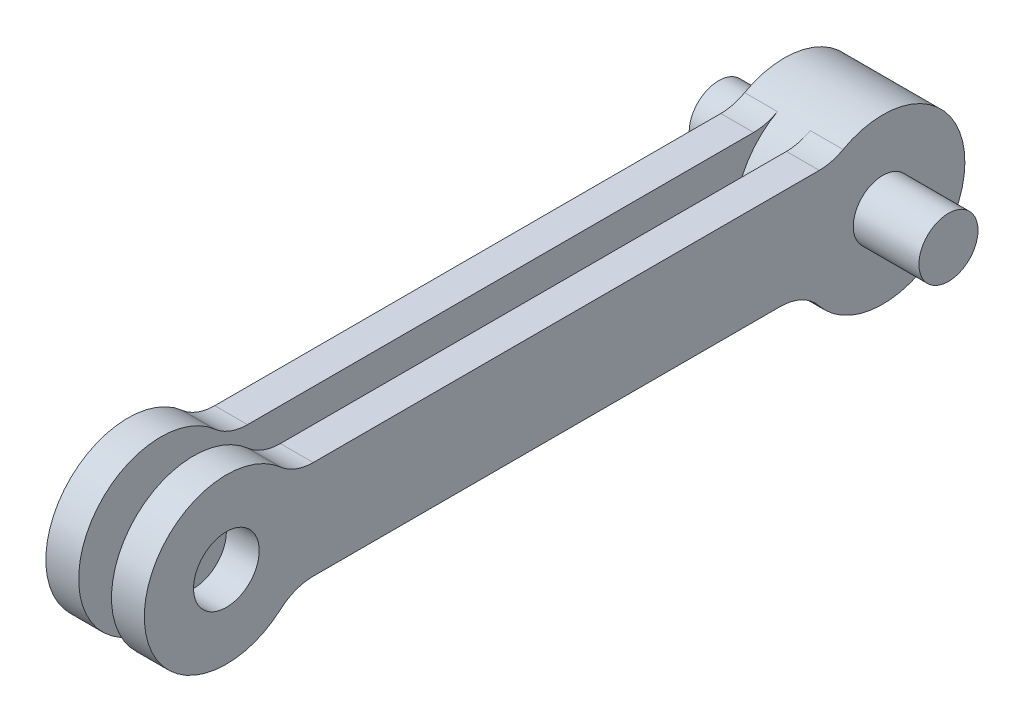
ISO-10303-21;
HEADER;
FILE_DESCRIPTION(('STEP AP214'),'2;1');
FILE_NAME('part.step','',(''),(''),'','','');
FILE_SCHEMA(('AUTOMOTIVE_DESIGN { 1 0 10303 214 1 1 1 1 }'));
ENDSEC;
DATA;
#1=APPLICATION_CONTEXT('core data for automotive mechanical design processes');
#2=APPLICATION_PROTOCOL_DEFINITION('international standard','automotive_design',2000,#1);
#3=PRODUCT_CONTEXT('',#1,'mechanical');
#4=PRODUCT('Part','Part','',(#3));
#5=PRODUCT_RELATED_PRODUCT_CATEGORY('part','',(#4));
#6=PRODUCT_DEFINITION_FORMATION('','',#4);
#7=PRODUCT_DEFINITION_CONTEXT('part definition',#1,'design');
#8=PRODUCT_DEFINITION('design','',#6,#7);
#9=PRODUCT_DEFINITION_SHAPE('','',#8);
#10=(LENGTH_UNIT() NAMED_UNIT(*) SI_UNIT(.MILLI.,.METRE.));
#11=(NAMED_UNIT(*) PLANE_ANGLE_UNIT() SI_UNIT($,.RADIAN.));
#12=(NAMED_UNIT(*) SI_UNIT($,.STERADIAN.) SOLID_ANGLE_UNIT());
#13=UNCERTAINTY_MEASURE_WITH_UNIT(LENGTH_MEASURE(1.E-05),#10,'distance_accuracy_value','');
#14=(GEOMETRIC_REPRESENTATION_CONTEXT(3) GLOBAL_UNCERTAINTY_ASSIGNED_CONTEXT((#13)) GLOBAL_UNIT_ASSIGNED_CONTEXT((#10,
#11,#12)) REPRESENTATION_CONTEXT('',''));
#15=CARTESIAN_POINT('',(0.,0.,0.));
#16=DIRECTION('',(0.,0.,1.));
#17=DIRECTION('',(1.,0.,0.));
#18=AXIS2_PLACEMENT_3D('',#15,#16,#17);
#19=CARTESIAN_POINT('',(0.,0.,0.));
#20=DIRECTION('',(1.,0.,0.));
#21=DIRECTION('',(0.,0.,-1.));
#22=AXIS2_PLACEMENT_3D('',#19,#20,#21);
#23=PLANE('',#22);
#24=CARTESIAN_POINT('',(0.,0.,0.));
#25=DIRECTION('',(1.,0.,0.));
#26=DIRECTION('',(0.,0.,-1.));
#27=AXIS2_PLACEMENT_3D('',#24,#25,#26);
#28=CIRCLE('',#27,2.);
#29=CARTESIAN_POINT('',(0.,0.,-2.));
#30=VERTEX_POINT('',#29);
#31=EDGE_CURVE('E236',#30,#30,#28,.T.);
#32=ORIENTED_EDGE('',*,*,#31,.T.);
#33=EDGE_LOOP('',(#32));
#34=FACE_BOUND('',#33,.T.);
#35=CARTESIAN_POINT('',(0.,5.99999999999999,-36.1270166537926));
#36=DIRECTION('',(1.,0.,0.));
#37=DIRECTION('',(0.,0.,-1.));
#38=AXIS2_PLACEMENT_3D('',#35,#36,#37);
#39=CIRCLE('',#38,3.);
#40=CARTESIAN_POINT('',(0.,2.99999999999999,-36.1270166537926));
#41=VERTEX_POINT('',#40);
#42=CARTESIAN_POINT('',(0.,3.375,-37.5793854086204));
#43=VERTEX_POINT('',#42);
#44=EDGE_CURVE('E86',#41,#43,#39,.T.);
#45=ORIENTED_EDGE('',*,*,#44,.T.);
#46=CARTESIAN_POINT('',(0.,-1.00000000000001,-40.));
#47=DIRECTION('',(1.,0.,0.));
#48=DIRECTION('',(0.,0.,-1.));
#49=AXIS2_PLACEMENT_3D('',#46,#47,#48);
#50=CIRCLE('',#49,5.);
#51=CARTESIAN_POINT('',(0.,-4.12499999999998,-36.096876251001));
#52=VERTEX_POINT('',#51);
#53=EDGE_CURVE('E231',#43,#52,#50,.T.);
#54=ORIENTED_EDGE('',*,*,#53,.T.);
#55=CARTESIAN_POINT('',(0.,-6.00000000000001,-33.7550020016016));
#56=DIRECTION('',(1.,0.,0.));
#57=DIRECTION('',(0.,0.,-1.));
#58=AXIS2_PLACEMENT_3D('',#55,#56,#57);
#59=CIRCLE('',#58,3.);
#60=CARTESIAN_POINT('',(0.,-3.00000000000001,-33.7550020016016));
#61=VERTEX_POINT('',#60);
#62=EDGE_CURVE('E282',#52,#61,#59,.T.);
#63=ORIENTED_EDGE('',*,*,#62,.T.);
#64=DIRECTION('',(0.,0.,-1.));
#65=VECTOR('',#64,1.);
#66=CARTESIAN_POINT('',(0.,-3.00000000000001,0.));
#67=LINE('',#66,#65);
#68=CARTESIAN_POINT('',(0.,-3.00000000000001,-5.29150262212916));
#69=VERTEX_POINT('',#68);
#70=EDGE_CURVE('E251',#69,#61,#67,.T.);
#71=ORIENTED_EDGE('',*,*,#70,.F.);
#72=CARTESIAN_POINT('',(0.,-6.00000000000001,-5.29150262212916));
#73=DIRECTION('',(1.,0.,0.));
#74=DIRECTION('',(0.,0.,-1.));
#75=AXIS2_PLACEMENT_3D('',#72,#73,#74);
#76=CIRCLE('',#75,3.);
#77=CARTESIAN_POINT('',(0.,-3.75,-3.30718913883072));
#78=VERTEX_POINT('',#77);
#79=EDGE_CURVE('E278',#69,#78,#76,.T.);
#80=ORIENTED_EDGE('',*,*,#79,.T.);
#81=CARTESIAN_POINT('',(0.,0.,0.));
#82=DIRECTION('',(1.,0.,0.));
#83=DIRECTION('',(0.,0.,-1.));
#84=AXIS2_PLACEMENT_3D('',#81,#82,#83);
#85=CIRCLE('',#84,4.99999999999999);
#86=CARTESIAN_POINT('',(0.,3.74999999999999,-3.30718913883074));
#87=VERTEX_POINT('',#86);
#88=EDGE_CURVE('E244',#87,#78,#85,.T.);
#89=ORIENTED_EDGE('',*,*,#88,.F.);
#90=CARTESIAN_POINT('',(0.,5.99999999999999,-5.29150262212918));
#91=DIRECTION('',(1.,0.,0.));
#92=DIRECTION('',(0.,0.,-1.));
#93=AXIS2_PLACEMENT_3D('',#90,#91,#92);
#94=CIRCLE('',#93,3.);
#95=CARTESIAN_POINT('',(0.,2.99999999999999,-5.29150262212918));
#96=VERTEX_POINT('',#95);
#97=EDGE_CURVE('E79',#87,#96,#94,.T.);
#98=ORIENTED_EDGE('',*,*,#97,.T.);
#99=DIRECTION('',(0.,0.,-1.));
#100=VECTOR('',#99,1.);
#101=CARTESIAN_POINT('',(0.,2.99999999999999,0.));
#102=LINE('',#101,#100);
#103=EDGE_CURVE('E254',#96,#41,#102,.T.);
#104=ORIENTED_EDGE('',*,*,#103,.T.);
#105=EDGE_LOOP('',(#45,#54,#63,#71,#80,#89,#98,#104));
#106=FACE_BOUND('',#105,.T.);
#107=ADVANCED_FACE('F71',(#34,#106),#23,.F.);
#108=CARTESIAN_POINT('',(2.,0.,0.));
#109=DIRECTION('',(1.,0.,0.));
#110=DIRECTION('',(0.,0.,-1.));
#111=AXIS2_PLACEMENT_3D('',#108,#109,#110);
#112=PLANE('',#111);
#113=CARTESIAN_POINT('',(2.,-0.999999999999973,-39.9999999999999));
#114=DIRECTION('',(1.,0.,0.));
#115=DIRECTION('',(0.,0.,-0.999999999999997));
#116=AXIS2_PLACEMENT_3D('',#113,#114,#115);
#117=CIRCLE('',#116,1.8);
#118=CARTESIAN_POINT('',(2.,-0.999999999999973,-41.7999999999999));
#119=VERTEX_POINT('',#118);
#120=EDGE_CURVE('E533',#119,#119,#117,.T.);
#121=ORIENTED_EDGE('',*,*,#120,.F.);
#122=EDGE_LOOP('',(#121));
#123=FACE_BOUND('',#122,.T.);
#124=CARTESIAN_POINT('',(2.,0.,0.));
#125=DIRECTION('',(1.,0.,0.));
#126=DIRECTION('',(0.,0.,-1.));
#127=AXIS2_PLACEMENT_3D('',#124,#125,#126);
#128=CIRCLE('',#127,2.);
#129=CARTESIAN_POINT('',(2.,0.,-2.));
#130=VERTEX_POINT('',#129);
#131=EDGE_CURVE('E233',#130,#130,#128,.T.);
#132=ORIENTED_EDGE('',*,*,#131,.F.);
#133=EDGE_LOOP('',(#132));
#134=FACE_BOUND('',#133,.T.);
#135=DIRECTION('',(0.,0.,-1.));
#136=VECTOR('',#135,1.);
#137=CARTESIAN_POINT('',(2.,-3.00000000000001,0.));
#138=LINE('',#137,#136);
#139=CARTESIAN_POINT('',(2.,-3.00000000000001,-5.29150262212916));
#140=VERTEX_POINT('',#139);
#141=CARTESIAN_POINT('',(2.,-3.00000000000001,-33.7550020016016));
#142=VERTEX_POINT('',#141);
#143=EDGE_CURVE('E247',#140,#142,#138,.T.);
#144=ORIENTED_EDGE('',*,*,#143,.T.);
#145=CARTESIAN_POINT('',(2.,-6.00000000000001,-33.7550020016016));
#146=DIRECTION('',(1.,0.,0.));
#147=DIRECTION('',(0.,0.,-1.));
#148=AXIS2_PLACEMENT_3D('',#145,#146,#147);
#149=CIRCLE('',#148,3.);
#150=CARTESIAN_POINT('',(2.,-4.125,-36.096876251001));
#151=VERTEX_POINT('',#150);
#152=EDGE_CURVE('E284',#142,#151,#149,.F.);
#153=ORIENTED_EDGE('',*,*,#152,.T.);
#154=CARTESIAN_POINT('',(2.,-1.00000000000001,-40.));
#155=DIRECTION('',(1.,0.,0.));
#156=DIRECTION('',(0.,0.,-1.));
#157=AXIS2_PLACEMENT_3D('',#154,#155,#156);
#158=CIRCLE('',#157,5.);
#159=CARTESIAN_POINT('',(2.,3.375,-37.5793854086204));
#160=VERTEX_POINT('',#159);
#161=EDGE_CURVE('E239',#151,#160,#158,.T.);
#162=ORIENTED_EDGE('',*,*,#161,.T.);
#163=CARTESIAN_POINT('',(2.,5.99999999999999,-36.1270166537926));
#164=DIRECTION('',(1.,0.,0.));
#165=DIRECTION('',(0.,0.,-1.));
#166=AXIS2_PLACEMENT_3D('',#163,#164,#165);
#167=CIRCLE('',#166,3.);
#168=CARTESIAN_POINT('',(2.,2.99999999999999,-36.1270166537926));
#169=VERTEX_POINT('',#168);
#170=EDGE_CURVE('E287',#160,#169,#167,.F.);
#171=ORIENTED_EDGE('',*,*,#170,.T.);
#172=DIRECTION('',(0.,0.,-1.));
#173=VECTOR('',#172,1.);
#174=CARTESIAN_POINT('',(2.,2.99999999999999,0.));
#175=LINE('',#174,#173);
#176=CARTESIAN_POINT('',(2.,2.99999999999999,-5.29150262212918));
#177=VERTEX_POINT('',#176);
#178=EDGE_CURVE('E248',#177,#169,#175,.T.);
#179=ORIENTED_EDGE('',*,*,#178,.F.);
#180=CARTESIAN_POINT('',(2.,5.99999999999999,-5.29150262212918));
#181=DIRECTION('',(1.,0.,0.));
#182=DIRECTION('',(0.,0.,-1.));
#183=AXIS2_PLACEMENT_3D('',#180,#181,#182);
#184=CIRCLE('',#183,3.);
#185=CARTESIAN_POINT('',(2.,3.74999999999999,-3.30718913883074));
#186=VERTEX_POINT('',#185);
#187=EDGE_CURVE('E12',#177,#186,#184,.F.);
#188=ORIENTED_EDGE('',*,*,#187,.T.);
#189=CARTESIAN_POINT('',(2.,0.,0.));
#190=DIRECTION('',(1.,0.,0.));
#191=DIRECTION('',(0.,0.,-1.));
#192=AXIS2_PLACEMENT_3D('',#189,#190,#191);
#193=CIRCLE('',#192,4.99999999999999);
#194=CARTESIAN_POINT('',(2.,-3.75,-3.30718913883072));
#195=VERTEX_POINT('',#194);
#196=EDGE_CURVE('E240',#186,#195,#193,.T.);
#197=ORIENTED_EDGE('',*,*,#196,.T.);
#198=CARTESIAN_POINT('',(2.,-6.00000000000001,-5.29150262212916));
#199=DIRECTION('',(1.,0.,0.));
#200=DIRECTION('',(0.,0.,-1.));
#201=AXIS2_PLACEMENT_3D('',#198,#199,#200);
#202=CIRCLE('',#201,3.);
#203=EDGE_CURVE('E280',#195,#140,#202,.F.);
#204=ORIENTED_EDGE('',*,*,#203,.T.);
#205=EDGE_LOOP('',(#144,#153,#162,#171,#179,#188,#197,#204));
#206=FACE_BOUND('',#205,.T.);
#207=ADVANCED_FACE('F291',(#123,#134,#206),#112,.T.);
#208=CARTESIAN_POINT('',(2.,0.,0.));
#209=DIRECTION('',(-1.,0.,0.));
#210=DIRECTION('',(0.,0.,1.));
#211=AXIS2_PLACEMENT_3D('',#208,#209,#210);
#212=CYLINDRICAL_SURFACE('',#211,4.99999999999999);
#213=ORIENTED_EDGE('',*,*,#88,.T.);
#214=DIRECTION('',(-1.,0.,0.));
#215=VECTOR('',#214,1.);
#216=CARTESIAN_POINT('',(2.,-3.75,-3.30718913883072));
#217=LINE('',#216,#215);
#218=EDGE_CURVE('E267',#78,#195,#217,.F.);
#219=ORIENTED_EDGE('',*,*,#218,.T.);
#220=ORIENTED_EDGE('',*,*,#196,.F.);
#221=DIRECTION('',(-1.,0.,0.));
#222=VECTOR('',#221,1.);
#223=CARTESIAN_POINT('',(2.,3.74999999999999,-3.30718913883074));
#224=LINE('',#223,#222);
#225=EDGE_CURVE('E264',#186,#87,#224,.T.);
#226=ORIENTED_EDGE('',*,*,#225,.T.);
#227=EDGE_LOOP('',(#213,#219,#220,#226));
#228=FACE_BOUND('',#227,.T.);
#229=ADVANCED_FACE('F312',(#228),#212,.T.);
#230=CARTESIAN_POINT('',(2.,-1.00000000000001,-40.));
#231=DIRECTION('',(-1.,0.,0.));
#232=DIRECTION('',(0.,0.,1.));
#233=AXIS2_PLACEMENT_3D('',#230,#231,#232);
#234=CYLINDRICAL_SURFACE('',#233,5.);
#235=ORIENTED_EDGE('',*,*,#161,.F.);
#236=DIRECTION('',(-1.,0.,0.));
#237=VECTOR('',#236,1.);
#238=CARTESIAN_POINT('',(2.,-4.12500000000001,-36.096876251001));
#239=LINE('',#238,#237);
#240=EDGE_CURVE('E271',#151,#52,#239,.T.);
#241=ORIENTED_EDGE('',*,*,#240,.T.);
#242=ORIENTED_EDGE('',*,*,#53,.F.);
#243=DIRECTION('',(-1.,0.,0.));
#244=VECTOR('',#243,1.);
#245=CARTESIAN_POINT('',(2.,3.375,-37.5793854086204));
#246=LINE('',#245,#244);
#247=EDGE_CURVE('E269',#43,#160,#246,.F.);
#248=ORIENTED_EDGE('',*,*,#247,.T.);
#249=EDGE_LOOP('',(#235,#241,#242,#248));
#250=FACE_BOUND('',#249,.T.);
#251=CARTESIAN_POINT('',(-4.,-1.00000000000001,-40.));
#252=DIRECTION('',(1.,0.,0.));
#253=DIRECTION('',(0.,0.,-1.));
#254=AXIS2_PLACEMENT_3D('',#251,#252,#253);
#255=CIRCLE('',#254,5.);
#256=CARTESIAN_POINT('',(-4.,-4.125,-36.096876251001));
#257=VERTEX_POINT('',#256);
#258=CARTESIAN_POINT('',(-4.,3.375,-37.5793854086204));
#259=VERTEX_POINT('',#258);
#260=EDGE_CURVE('E548',#257,#259,#255,.T.);
#261=ORIENTED_EDGE('',*,*,#260,.T.);
#262=DIRECTION('',(1.,0.,0.));
#263=VECTOR('',#262,1.);
#264=CARTESIAN_POINT('',(-4.,3.375,-37.5793854086204));
#265=LINE('',#264,#263);
#266=CARTESIAN_POINT('',(-2.,3.375,-37.5793854086204));
#267=VERTEX_POINT('',#266);
#268=EDGE_CURVE('E197',#267,#259,#265,.F.);
#269=ORIENTED_EDGE('',*,*,#268,.F.);
#270=CARTESIAN_POINT('',(-2.,-1.00000000000001,-40.));
#271=DIRECTION('',(1.,0.,0.));
#272=DIRECTION('',(0.,0.,-1.));
#273=AXIS2_PLACEMENT_3D('',#270,#271,#272);
#274=CIRCLE('',#273,5.);
#275=CARTESIAN_POINT('',(-2.,-4.12499999999998,-36.096876251001));
#276=VERTEX_POINT('',#275);
#277=EDGE_CURVE('E200',#267,#276,#274,.T.);
#278=ORIENTED_EDGE('',*,*,#277,.T.);
#279=DIRECTION('',(1.,0.,0.));
#280=VECTOR('',#279,1.);
#281=CARTESIAN_POINT('',(-4.,-4.12500000000001,-36.096876251001));
#282=LINE('',#281,#280);
#283=EDGE_CURVE('E185',#257,#276,#282,.T.);
#284=ORIENTED_EDGE('',*,*,#283,.F.);
#285=EDGE_LOOP('',(#261,#269,#278,#284));
#286=FACE_BOUND('',#285,.T.);
#287=ADVANCED_FACE('F201',(#250,#286),#234,.T.);
#288=CARTESIAN_POINT('',(2.,2.99999999999999,0.));
#289=DIRECTION('',(0.,1.,0.));
#290=DIRECTION('',(0.,0.,1.));
#291=AXIS2_PLACEMENT_3D('',#288,#289,#290);
#292=PLANE('',#291);
#293=ORIENTED_EDGE('',*,*,#178,.T.);
#294=DIRECTION('',(-1.,0.,0.));
#295=VECTOR('',#294,1.);
#296=CARTESIAN_POINT('',(2.,2.99999999999999,-36.1270166537926));
#297=LINE('',#296,#295);
#298=EDGE_CURVE('E276',#169,#41,#297,.T.);
#299=ORIENTED_EDGE('',*,*,#298,.T.);
#300=ORIENTED_EDGE('',*,*,#103,.F.);
#301=DIRECTION('',(-1.,0.,0.));
#302=VECTOR('',#301,1.);
#303=CARTESIAN_POINT('',(2.,2.99999999999999,-5.29150262212918));
#304=LINE('',#303,#302);
#305=EDGE_CURVE('E274',#96,#177,#304,.F.);
#306=ORIENTED_EDGE('',*,*,#305,.T.);
#307=EDGE_LOOP('',(#293,#299,#300,#306));
#308=FACE_BOUND('',#307,.T.);
#309=ADVANCED_FACE('F295',(#308),#292,.T.);
#310=CARTESIAN_POINT('',(2.,-3.00000000000001,0.));
#311=DIRECTION('',(0.,1.,0.));
#312=DIRECTION('',(0.,0.,1.));
#313=AXIS2_PLACEMENT_3D('',#310,#311,#312);
#314=PLANE('',#313);
#315=ORIENTED_EDGE('',*,*,#143,.F.);
#316=DIRECTION('',(1.,0.,0.));
#317=VECTOR('',#316,1.);
#318=CARTESIAN_POINT('',(0.,-3.00000000000001,-5.29150262212916));
#319=LINE('',#318,#317);
#320=EDGE_CURVE('E261',#140,#69,#319,.F.);
#321=ORIENTED_EDGE('',*,*,#320,.T.);
#322=ORIENTED_EDGE('',*,*,#70,.T.);
#323=DIRECTION('',(1.,0.,0.));
#324=VECTOR('',#323,1.);
#325=CARTESIAN_POINT('',(2.,-3.00000000000001,-33.7550020016016));
#326=LINE('',#325,#324);
#327=EDGE_CURVE('E243',#61,#142,#326,.T.);
#328=ORIENTED_EDGE('',*,*,#327,.T.);
#329=EDGE_LOOP('',(#315,#321,#322,#328));
#330=FACE_BOUND('',#329,.T.);
#331=ADVANCED_FACE('F324',(#330),#314,.F.);
#332=CARTESIAN_POINT('',(-1.2E-05,0.,0.));
#333=DIRECTION('',(1.,0.,0.));
#334=DIRECTION('',(0.,0.,-1.));
#335=AXIS2_PLACEMENT_3D('',#332,#333,#334);
#336=CYLINDRICAL_SURFACE('',#335,2.);
#337=CARTESIAN_POINT('',(2.,0.,-2.));
#338=CARTESIAN_POINT('',(1.97916666666667,0.,-2.));
#339=CARTESIAN_POINT('',(1.95833333333333,0.,-2.));
#340=CARTESIAN_POINT('',(1.91666666666667,0.,-2.));
#341=CARTESIAN_POINT('',(1.89583333333333,0.,-2.));
#342=CARTESIAN_POINT('',(1.85416666666667,0.,-2.));
#343=CARTESIAN_POINT('',(1.83333333333333,0.,-2.));
#344=CARTESIAN_POINT('',(1.79166666666667,0.,-2.));
#345=CARTESIAN_POINT('',(1.77083333333333,0.,-2.));
#346=CARTESIAN_POINT('',(1.72916666666667,0.,-2.));
#347=CARTESIAN_POINT('',(1.70833333333333,0.,-2.));
#348=CARTESIAN_POINT('',(1.66666666666667,0.,-2.));
#349=CARTESIAN_POINT('',(1.64583333333333,0.,-2.));
#350=CARTESIAN_POINT('',(1.60416666666667,0.,-2.));
#351=CARTESIAN_POINT('',(1.58333333333333,0.,-2.));
#352=CARTESIAN_POINT('',(1.54166666666667,0.,-2.));
#353=CARTESIAN_POINT('',(1.52083333333333,0.,-2.));
#354=CARTESIAN_POINT('',(1.47916666666667,0.,-2.));
#355=CARTESIAN_POINT('',(1.45833333333333,0.,-2.));
#356=CARTESIAN_POINT('',(1.41666666666667,0.,-2.));
#357=CARTESIAN_POINT('',(1.39583333333333,0.,-2.));
#358=CARTESIAN_POINT('',(1.35416666666667,0.,-2.));
#359=CARTESIAN_POINT('',(1.33333333333333,0.,-2.));
#360=CARTESIAN_POINT('',(1.29166666666667,0.,-2.));
#361=CARTESIAN_POINT('',(1.27083333333333,0.,-2.));
#362=CARTESIAN_POINT('',(1.22916666666667,0.,-2.));
#363=CARTESIAN_POINT('',(1.20833333333333,0.,-2.));
#364=CARTESIAN_POINT('',(1.16666666666667,0.,-2.));
#365=CARTESIAN_POINT('',(1.14583333333333,0.,-2.));
#366=CARTESIAN_POINT('',(1.10416666666667,0.,-2.));
#367=CARTESIAN_POINT('',(1.08333333333333,0.,-2.));
#368=CARTESIAN_POINT('',(1.04166666666667,0.,-2.));
#369=CARTESIAN_POINT('',(1.02083333333333,0.,-2.));
#370=CARTESIAN_POINT('',(0.979166666666667,0.,-2.));
#371=CARTESIAN_POINT('',(0.958333333333334,0.,-2.));
#372=CARTESIAN_POINT('',(0.916666666666667,0.,-2.));
#373=CARTESIAN_POINT('',(0.895833333333334,0.,-2.));
#374=CARTESIAN_POINT('',(0.854166666666667,0.,-2.));
#375=CARTESIAN_POINT('',(0.833333333333334,0.,-2.));
#376=CARTESIAN_POINT('',(0.791666666666667,0.,-2.));
#377=CARTESIAN_POINT('',(0.770833333333334,0.,-2.));
#378=CARTESIAN_POINT('',(0.729166666666667,0.,-2.));
#379=CARTESIAN_POINT('',(0.708333333333334,0.,-2.));
#380=CARTESIAN_POINT('',(0.666666666666667,0.,-2.));
#381=CARTESIAN_POINT('',(0.645833333333334,0.,-2.));
#382=CARTESIAN_POINT('',(0.604166666666667,0.,-2.));
#383=CARTESIAN_POINT('',(0.583333333333333,0.,-2.));
#384=CARTESIAN_POINT('',(0.541666666666667,0.,-2.));
#385=CARTESIAN_POINT('',(0.520833333333333,0.,-2.));
#386=CARTESIAN_POINT('',(0.479166666666667,0.,-2.));
#387=CARTESIAN_POINT('',(0.458333333333334,0.,-2.));
#388=CARTESIAN_POINT('',(0.416666666666667,0.,-2.));
#389=CARTESIAN_POINT('',(0.395833333333334,0.,-2.));
#390=CARTESIAN_POINT('',(0.354166666666667,0.,-2.));
#391=CARTESIAN_POINT('',(0.333333333333334,0.,-2.));
#392=CARTESIAN_POINT('',(0.291666666666667,0.,-2.));
#393=CARTESIAN_POINT('',(0.270833333333333,0.,-2.));
#394=CARTESIAN_POINT('',(0.229166666666667,0.,-2.));
#395=CARTESIAN_POINT('',(0.208333333333333,0.,-2.));
#396=CARTESIAN_POINT('',(0.166666666666667,0.,-2.));
#397=CARTESIAN_POINT('',(0.145833333333334,0.,-2.));
#398=CARTESIAN_POINT('',(0.104166666666667,0.,-2.));
#399=CARTESIAN_POINT('',(0.0833333333333336,0.,-2.));
#400=CARTESIAN_POINT('',(0.0416666666666669,0.,-2.));
#401=CARTESIAN_POINT('',(0.0208333333333335,0.,-2.));
#402=CARTESIAN_POINT('',(0.,0.,-2.));
#403=B_SPLINE_CURVE_WITH_KNOTS('',3,(#337,#338,#339,#340,#341,#342,#343,#344,#345,#346,#347,
#348,#349,#350,#351,#352,#353,#354,#355,#356,#357,#358,#359,#360,#361,#362,#363,#364,#365,#366,
#367,#368,#369,#370,#371,#372,#373,#374,#375,#376,#377,#378,#379,#380,#381,#382,#383,#384,#385,
#386,#387,#388,#389,#390,#391,#392,#393,#394,#395,#396,#397,#398,#399,#400,#401,#402),
.UNSPECIFIED.,.F.,.F.,(4,2,2,2,2,2,2,2,2,2,2,2,2,2,2,2,2,2,2,2,2,2,2,2,2,2,2,2,2,2,2,2,4),(0.,
0.0624999999999996,0.125,0.1875,0.25,0.3125,0.375,0.4375,0.5,0.5625,0.625,0.6875,0.75,0.8125,
0.875,0.9375,1.,1.0625,1.125,1.1875,1.25,1.3125,1.375,1.4375,1.5,1.5625,1.625,1.6875,1.75,
1.8125,1.875,1.9375,2.),.UNSPECIFIED.);
#404=EDGE_CURVE('BSEAM320',#130,#30,#403,.T.);
#405=ORIENTED_EDGE('',*,*,#131,.T.);
#406=ORIENTED_EDGE('',*,*,#31,.F.);
#407=ORIENTED_EDGE('',*,*,#404,.T.);
#408=ORIENTED_EDGE('',*,*,#404,.F.);
#409=EDGE_LOOP('',(#405,#407,#406,#408));
#410=FACE_BOUND('',#409,.T.);
#411=ADVANCED_FACE('F320',(#410),#336,.F.);
#412=CARTESIAN_POINT('',(2.,-6.00000000000001,-5.29150262212916));
#413=DIRECTION('',(-1.,0.,0.));
#414=DIRECTION('',(0.,0.,1.));
#415=AXIS2_PLACEMENT_3D('',#412,#413,#414);
#416=CYLINDRICAL_SURFACE('',#415,3.);
#417=ORIENTED_EDGE('',*,*,#203,.F.);
#418=ORIENTED_EDGE('',*,*,#218,.F.);
#419=ORIENTED_EDGE('',*,*,#79,.F.);
#420=ORIENTED_EDGE('',*,*,#320,.F.);
#421=EDGE_LOOP('',(#417,#418,#419,#420));
#422=FACE_BOUND('',#421,.T.);
#423=ADVANCED_FACE('F306',(#422),#416,.F.);
#424=CARTESIAN_POINT('',(2.,-6.00000000000001,-33.7550020016016));
#425=DIRECTION('',(-1.,0.,0.));
#426=DIRECTION('',(0.,0.,1.));
#427=AXIS2_PLACEMENT_3D('',#424,#425,#426);
#428=CYLINDRICAL_SURFACE('',#427,3.);
#429=ORIENTED_EDGE('',*,*,#152,.F.);
#430=ORIENTED_EDGE('',*,*,#327,.F.);
#431=ORIENTED_EDGE('',*,*,#62,.F.);
#432=ORIENTED_EDGE('',*,*,#240,.F.);
#433=EDGE_LOOP('',(#429,#430,#431,#432));
#434=FACE_BOUND('',#433,.T.);
#435=ADVANCED_FACE('F299',(#434),#428,.F.);
#436=CARTESIAN_POINT('',(2.,5.99999999999999,-36.1270166537926));
#437=DIRECTION('',(-1.,0.,0.));
#438=DIRECTION('',(0.,0.,1.));
#439=AXIS2_PLACEMENT_3D('',#436,#437,#438);
#440=CYLINDRICAL_SURFACE('',#439,3.);
#441=ORIENTED_EDGE('',*,*,#170,.F.);
#442=ORIENTED_EDGE('',*,*,#247,.F.);
#443=ORIENTED_EDGE('',*,*,#44,.F.);
#444=ORIENTED_EDGE('',*,*,#298,.F.);
#445=EDGE_LOOP('',(#441,#442,#443,#444));
#446=FACE_BOUND('',#445,.T.);
#447=ADVANCED_FACE('F297',(#446),#440,.F.);
#448=CARTESIAN_POINT('',(2.,5.99999999999999,-5.29150262212918));
#449=DIRECTION('',(-1.,0.,0.));
#450=DIRECTION('',(0.,0.,1.));
#451=AXIS2_PLACEMENT_3D('',#448,#449,#450);
#452=CYLINDRICAL_SURFACE('',#451,3.);
#453=ORIENTED_EDGE('',*,*,#187,.F.);
#454=ORIENTED_EDGE('',*,*,#305,.F.);
#455=ORIENTED_EDGE('',*,*,#97,.F.);
#456=ORIENTED_EDGE('',*,*,#225,.F.);
#457=EDGE_LOOP('',(#453,#454,#455,#456));
#458=FACE_BOUND('',#457,.T.);
#459=ADVANCED_FACE('F73',(#458),#452,.F.);
#460=CARTESIAN_POINT('',(-2.,0.,0.));
#461=DIRECTION('',(-1.,0.,0.));
#462=DIRECTION('',(0.,0.,-1.));
#463=AXIS2_PLACEMENT_3D('',#460,#461,#462);
#464=PLANE('',#463);
#465=CARTESIAN_POINT('',(-2.,0.,0.));
#466=DIRECTION('',(1.,0.,0.));
#467=DIRECTION('',(0.,0.,-1.));
#468=AXIS2_PLACEMENT_3D('',#465,#466,#467);
#469=CIRCLE('',#468,2.);
#470=CARTESIAN_POINT('',(-2.,0.,-2.));
#471=VERTEX_POINT('',#470);
#472=EDGE_CURVE('E545',#471,#471,#469,.T.);
#473=ORIENTED_EDGE('',*,*,#472,.F.);
#474=EDGE_LOOP('',(#473));
#475=FACE_BOUND('',#474,.T.);
#476=CARTESIAN_POINT('',(-2.,5.99999999999999,-36.1270166537926));
#477=DIRECTION('',(1.,0.,0.));
#478=DIRECTION('',(0.,0.,-1.));
#479=AXIS2_PLACEMENT_3D('',#476,#477,#478);
#480=CIRCLE('',#479,3.);
#481=CARTESIAN_POINT('',(-2.,2.99999999999999,-36.1270166537926));
#482=VERTEX_POINT('',#481);
#483=EDGE_CURVE('E214',#482,#267,#480,.T.);
#484=ORIENTED_EDGE('',*,*,#483,.F.);
#485=DIRECTION('',(0.,0.,-1.));
#486=VECTOR('',#485,1.);
#487=CARTESIAN_POINT('',(-2.,2.99999999999999,0.));
#488=LINE('',#487,#486);
#489=CARTESIAN_POINT('',(-2.,2.99999999999999,-5.29150262212918));
#490=VERTEX_POINT('',#489);
#491=EDGE_CURVE('E562',#490,#482,#488,.T.);
#492=ORIENTED_EDGE('',*,*,#491,.F.);
#493=CARTESIAN_POINT('',(-2.,5.99999999999999,-5.29150262212918));
#494=DIRECTION('',(1.,0.,0.));
#495=DIRECTION('',(0.,0.,-1.));
#496=AXIS2_PLACEMENT_3D('',#493,#494,#495);
#497=CIRCLE('',#496,3.);
#498=CARTESIAN_POINT('',(-2.,3.74999999999999,-3.30718913883074));
#499=VERTEX_POINT('',#498);
#500=EDGE_CURVE('E225',#499,#490,#497,.T.);
#501=ORIENTED_EDGE('',*,*,#500,.F.);
#502=CARTESIAN_POINT('',(-2.,0.,0.));
#503=DIRECTION('',(1.,0.,0.));
#504=DIRECTION('',(0.,0.,-1.));
#505=AXIS2_PLACEMENT_3D('',#502,#503,#504);
#506=CIRCLE('',#505,4.99999999999999);
#507=CARTESIAN_POINT('',(-2.,-3.75,-3.30718913883072));
#508=VERTEX_POINT('',#507);
#509=EDGE_CURVE('E553',#499,#508,#506,.T.);
#510=ORIENTED_EDGE('',*,*,#509,.T.);
#511=CARTESIAN_POINT('',(-2.,-6.00000000000001,-5.29150262212916));
#512=DIRECTION('',(1.,0.,0.));
#513=DIRECTION('',(0.,0.,-1.));
#514=AXIS2_PLACEMENT_3D('',#511,#512,#513);
#515=CIRCLE('',#514,3.);
#516=CARTESIAN_POINT('',(-2.,-3.00000000000001,-5.29150262212916));
#517=VERTEX_POINT('',#516);
#518=EDGE_CURVE('E217',#517,#508,#515,.T.);
#519=ORIENTED_EDGE('',*,*,#518,.F.);
#520=DIRECTION('',(0.,0.,-1.));
#521=VECTOR('',#520,1.);
#522=CARTESIAN_POINT('',(-2.,-3.00000000000001,0.));
#523=LINE('',#522,#521);
#524=CARTESIAN_POINT('',(-2.,-3.00000000000001,-33.7550020016016));
#525=VERTEX_POINT('',#524);
#526=EDGE_CURVE('E211',#517,#525,#523,.T.);
#527=ORIENTED_EDGE('',*,*,#526,.T.);
#528=CARTESIAN_POINT('',(-2.,-6.00000000000001,-33.7550020016016));
#529=DIRECTION('',(1.,0.,0.));
#530=DIRECTION('',(0.,0.,-1.));
#531=AXIS2_PLACEMENT_3D('',#528,#529,#530);
#532=CIRCLE('',#531,3.);
#533=EDGE_CURVE('E189',#276,#525,#532,.T.);
#534=ORIENTED_EDGE('',*,*,#533,.F.);
#535=ORIENTED_EDGE('',*,*,#277,.F.);
#536=EDGE_LOOP('',(#484,#492,#501,#510,#519,#527,#534,#535));
#537=FACE_BOUND('',#536,.T.);
#538=ADVANCED_FACE('F208',(#475,#537),#464,.F.);
#539=CARTESIAN_POINT('',(-4.,0.,0.));
#540=DIRECTION('',(-1.,0.,0.));
#541=DIRECTION('',(0.,0.,-1.));
#542=AXIS2_PLACEMENT_3D('',#539,#540,#541);
#543=PLANE('',#542);
#544=CARTESIAN_POINT('',(-4.,-0.999999999999973,-39.9999999999999));
#545=DIRECTION('',(-1.,0.,0.));
#546=DIRECTION('',(0.,0.,1.));
#547=AXIS2_PLACEMENT_3D('',#544,#545,#546);
#548=CIRCLE('',#547,1.8);
#549=CARTESIAN_POINT('',(-4.,-0.999999999999973,-38.1999999999999));
#550=VERTEX_POINT('',#549);
#551=EDGE_CURVE('E534',#550,#550,#548,.T.);
#552=ORIENTED_EDGE('',*,*,#551,.F.);
#553=EDGE_LOOP('',(#552));
#554=FACE_BOUND('',#553,.T.);
#555=CARTESIAN_POINT('',(-4.,0.,0.));
#556=DIRECTION('',(1.,0.,0.));
#557=DIRECTION('',(0.,0.,-1.));
#558=AXIS2_PLACEMENT_3D('',#555,#556,#557);
#559=CIRCLE('',#558,2.);
#560=CARTESIAN_POINT('',(-4.,0.,-2.));
#561=VERTEX_POINT('',#560);
#562=EDGE_CURVE('E205',#561,#561,#559,.T.);
#563=ORIENTED_EDGE('',*,*,#562,.T.);
#564=EDGE_LOOP('',(#563));
#565=FACE_BOUND('',#564,.T.);
#566=DIRECTION('',(0.,0.,-1.));
#567=VECTOR('',#566,1.);
#568=CARTESIAN_POINT('',(-4.,-3.00000000000001,0.));
#569=LINE('',#568,#567);
#570=CARTESIAN_POINT('',(-4.,-3.00000000000001,-5.29150262212916));
#571=VERTEX_POINT('',#570);
#572=CARTESIAN_POINT('',(-4.,-3.00000000000001,-33.7550020016016));
#573=VERTEX_POINT('',#572);
#574=EDGE_CURVE('E556',#571,#573,#569,.T.);
#575=ORIENTED_EDGE('',*,*,#574,.F.);
#576=CARTESIAN_POINT('',(-4.,-6.00000000000001,-5.29150262212916));
#577=DIRECTION('',(1.,0.,0.));
#578=DIRECTION('',(0.,0.,-1.));
#579=AXIS2_PLACEMENT_3D('',#576,#577,#578);
#580=CIRCLE('',#579,3.);
#581=CARTESIAN_POINT('',(-4.,-3.75,-3.30718913883072));
#582=VERTEX_POINT('',#581);
#583=EDGE_CURVE('E212',#582,#571,#580,.F.);
#584=ORIENTED_EDGE('',*,*,#583,.F.);
#585=CARTESIAN_POINT('',(-4.,0.,0.));
#586=DIRECTION('',(1.,0.,0.));
#587=DIRECTION('',(0.,0.,-1.));
#588=AXIS2_PLACEMENT_3D('',#585,#586,#587);
#589=CIRCLE('',#588,4.99999999999999);
#590=CARTESIAN_POINT('',(-4.,3.74999999999999,-3.30718913883074));
#591=VERTEX_POINT('',#590);
#592=EDGE_CURVE('E549',#591,#582,#589,.T.);
#593=ORIENTED_EDGE('',*,*,#592,.F.);
#594=CARTESIAN_POINT('',(-4.,5.99999999999999,-5.29150262212918));
#595=DIRECTION('',(1.,0.,0.));
#596=DIRECTION('',(0.,0.,-1.));
#597=AXIS2_PLACEMENT_3D('',#594,#595,#596);
#598=CIRCLE('',#597,3.);
#599=CARTESIAN_POINT('',(-4.,2.99999999999999,-5.29150262212918));
#600=VERTEX_POINT('',#599);
#601=EDGE_CURVE('E228',#600,#591,#598,.F.);
#602=ORIENTED_EDGE('',*,*,#601,.F.);
#603=DIRECTION('',(0.,0.,-1.));
#604=VECTOR('',#603,1.);
#605=CARTESIAN_POINT('',(-4.,2.99999999999999,0.));
#606=LINE('',#605,#604);
#607=CARTESIAN_POINT('',(-4.,2.99999999999999,-36.1270166537926));
#608=VERTEX_POINT('',#607);
#609=EDGE_CURVE('E557',#600,#608,#606,.T.);
#610=ORIENTED_EDGE('',*,*,#609,.T.);
#611=CARTESIAN_POINT('',(-4.,5.99999999999999,-36.1270166537926));
#612=DIRECTION('',(1.,0.,0.));
#613=DIRECTION('',(0.,0.,-1.));
#614=AXIS2_PLACEMENT_3D('',#611,#612,#613);
#615=CIRCLE('',#614,3.);
#616=EDGE_CURVE('E222',#259,#608,#615,.F.);
#617=ORIENTED_EDGE('',*,*,#616,.F.);
#618=ORIENTED_EDGE('',*,*,#260,.F.);
#619=CARTESIAN_POINT('',(-4.,-6.00000000000001,-33.7550020016016));
#620=DIRECTION('',(1.,0.,0.));
#621=DIRECTION('',(0.,0.,-1.));
#622=AXIS2_PLACEMENT_3D('',#619,#620,#621);
#623=CIRCLE('',#622,3.);
#624=EDGE_CURVE('E192',#573,#257,#623,.F.);
#625=ORIENTED_EDGE('',*,*,#624,.F.);
#626=EDGE_LOOP('',(#575,#584,#593,#602,#610,#617,#618,#625));
#627=FACE_BOUND('',#626,.T.);
#628=ADVANCED_FACE('F387',(#554,#565,#627),#543,.T.);
#629=CARTESIAN_POINT('',(-4.,0.,0.));
#630=DIRECTION('',(1.,0.,0.));
#631=DIRECTION('',(0.,0.,1.));
#632=AXIS2_PLACEMENT_3D('',#629,#630,#631);
#633=CYLINDRICAL_SURFACE('',#632,4.99999999999999);
#634=ORIENTED_EDGE('',*,*,#509,.F.);
#635=DIRECTION('',(1.,0.,0.));
#636=VECTOR('',#635,1.);
#637=CARTESIAN_POINT('',(-4.,3.74999999999999,-3.30718913883074));
#638=LINE('',#637,#636);
#639=EDGE_CURVE('E570',#591,#499,#638,.T.);
#640=ORIENTED_EDGE('',*,*,#639,.F.);
#641=ORIENTED_EDGE('',*,*,#592,.T.);
#642=DIRECTION('',(1.,0.,0.));
#643=VECTOR('',#642,1.);
#644=CARTESIAN_POINT('',(-4.,-3.75,-3.30718913883072));
#645=LINE('',#644,#643);
#646=EDGE_CURVE('E572',#508,#582,#645,.F.);
#647=ORIENTED_EDGE('',*,*,#646,.F.);
#648=EDGE_LOOP('',(#634,#640,#641,#647));
#649=FACE_BOUND('',#648,.T.);
#650=ADVANCED_FACE('F400',(#649),#633,.T.);
#651=CARTESIAN_POINT('',(-4.,2.99999999999999,0.));
#652=DIRECTION('',(0.,1.,0.));
#653=DIRECTION('',(0.,0.,1.));
#654=AXIS2_PLACEMENT_3D('',#651,#652,#653);
#655=PLANE('',#654);
#656=ORIENTED_EDGE('',*,*,#609,.F.);
#657=DIRECTION('',(1.,0.,0.));
#658=VECTOR('',#657,1.);
#659=CARTESIAN_POINT('',(-4.,2.99999999999999,-5.29150262212918));
#660=LINE('',#659,#658);
#661=EDGE_CURVE('E196',#490,#600,#660,.F.);
#662=ORIENTED_EDGE('',*,*,#661,.F.);
#663=ORIENTED_EDGE('',*,*,#491,.T.);
#664=DIRECTION('',(1.,0.,0.));
#665=VECTOR('',#664,1.);
#666=CARTESIAN_POINT('',(-4.,2.99999999999999,-36.1270166537926));
#667=LINE('',#666,#665);
#668=EDGE_CURVE('E576',#608,#482,#667,.T.);
#669=ORIENTED_EDGE('',*,*,#668,.F.);
#670=EDGE_LOOP('',(#656,#662,#663,#669));
#671=FACE_BOUND('',#670,.T.);
#672=ADVANCED_FACE('F411',(#671),#655,.T.);
#673=CARTESIAN_POINT('',(-4.,-3.00000000000001,0.));
#674=DIRECTION('',(0.,1.,0.));
#675=DIRECTION('',(0.,0.,1.));
#676=AXIS2_PLACEMENT_3D('',#673,#674,#675);
#677=PLANE('',#676);
#678=ORIENTED_EDGE('',*,*,#574,.T.);
#679=DIRECTION('',(-1.,0.,0.));
#680=VECTOR('',#679,1.);
#681=CARTESIAN_POINT('',(-4.,-3.00000000000001,-33.7550020016016));
#682=LINE('',#681,#680);
#683=EDGE_CURVE('E552',#525,#573,#682,.T.);
#684=ORIENTED_EDGE('',*,*,#683,.F.);
#685=ORIENTED_EDGE('',*,*,#526,.F.);
#686=DIRECTION('',(-1.,0.,0.));
#687=VECTOR('',#686,1.);
#688=CARTESIAN_POINT('',(-2.,-3.00000000000001,-5.29150262212916));
#689=LINE('',#688,#687);
#690=EDGE_CURVE('E568',#571,#517,#689,.F.);
#691=ORIENTED_EDGE('',*,*,#690,.F.);
#692=EDGE_LOOP('',(#678,#684,#685,#691));
#693=FACE_BOUND('',#692,.T.);
#694=ADVANCED_FACE('F421',(#693),#677,.F.);
#695=CARTESIAN_POINT('',(-1.999988,0.,0.));
#696=DIRECTION('',(-1.,0.,0.));
#697=DIRECTION('',(0.,0.,-1.));
#698=AXIS2_PLACEMENT_3D('',#695,#696,#697);
#699=CYLINDRICAL_SURFACE('',#698,2.);
#700=CARTESIAN_POINT('',(-4.,0.,-2.));
#701=CARTESIAN_POINT('',(-3.97916666666667,0.,-2.));
#702=CARTESIAN_POINT('',(-3.95833333333333,0.,-2.));
#703=CARTESIAN_POINT('',(-3.91666666666667,0.,-2.));
#704=CARTESIAN_POINT('',(-3.89583333333333,0.,-2.));
#705=CARTESIAN_POINT('',(-3.85416666666667,0.,-2.));
#706=CARTESIAN_POINT('',(-3.83333333333333,0.,-2.));
#707=CARTESIAN_POINT('',(-3.79166666666667,0.,-2.));
#708=CARTESIAN_POINT('',(-3.77083333333333,0.,-2.));
#709=CARTESIAN_POINT('',(-3.72916666666667,0.,-2.));
#710=CARTESIAN_POINT('',(-3.70833333333333,0.,-2.));
#711=CARTESIAN_POINT('',(-3.66666666666667,0.,-2.));
#712=CARTESIAN_POINT('',(-3.64583333333333,0.,-2.));
#713=CARTESIAN_POINT('',(-3.60416666666667,0.,-2.));
#714=CARTESIAN_POINT('',(-3.58333333333333,0.,-2.));
#715=CARTESIAN_POINT('',(-3.54166666666667,0.,-2.));
#716=CARTESIAN_POINT('',(-3.52083333333333,0.,-2.));
#717=CARTESIAN_POINT('',(-3.47916666666667,0.,-2.));
#718=CARTESIAN_POINT('',(-3.45833333333333,0.,-2.));
#719=CARTESIAN_POINT('',(-3.41666666666667,0.,-2.));
#720=CARTESIAN_POINT('',(-3.39583333333333,0.,-2.));
#721=CARTESIAN_POINT('',(-3.35416666666667,0.,-2.));
#722=CARTESIAN_POINT('',(-3.33333333333333,0.,-2.));
#723=CARTESIAN_POINT('',(-3.29166666666667,0.,-2.));
#724=CARTESIAN_POINT('',(-3.27083333333333,0.,-2.));
#725=CARTESIAN_POINT('',(-3.22916666666667,0.,-2.));
#726=CARTESIAN_POINT('',(-3.20833333333333,0.,-2.));
#727=CARTESIAN_POINT('',(-3.16666666666667,0.,-2.));
#728=CARTESIAN_POINT('',(-3.14583333333333,0.,-2.));
#729=CARTESIAN_POINT('',(-3.10416666666667,0.,-2.));
#730=CARTESIAN_POINT('',(-3.08333333333333,0.,-2.));
#731=CARTESIAN_POINT('',(-3.04166666666667,0.,-2.));
#732=CARTESIAN_POINT('',(-3.02083333333333,0.,-2.));
#733=CARTESIAN_POINT('',(-2.97916666666667,0.,-2.));
#734=CARTESIAN_POINT('',(-2.95833333333333,0.,-2.));
#735=CARTESIAN_POINT('',(-2.91666666666667,0.,-2.));
#736=CARTESIAN_POINT('',(-2.89583333333333,0.,-2.));
#737=CARTESIAN_POINT('',(-2.85416666666667,0.,-2.));
#738=CARTESIAN_POINT('',(-2.83333333333333,0.,-2.));
#739=CARTESIAN_POINT('',(-2.79166666666667,0.,-2.));
#740=CARTESIAN_POINT('',(-2.77083333333333,0.,-2.));
#741=CARTESIAN_POINT('',(-2.72916666666667,0.,-2.));
#742=CARTESIAN_POINT('',(-2.70833333333333,0.,-2.));
#743=CARTESIAN_POINT('',(-2.66666666666667,0.,-2.));
#744=CARTESIAN_POINT('',(-2.64583333333333,0.,-2.));
#745=CARTESIAN_POINT('',(-2.60416666666667,0.,-2.));
#746=CARTESIAN_POINT('',(-2.58333333333333,0.,-2.));
#747=CARTESIAN_POINT('',(-2.54166666666667,0.,-2.));
#748=CARTESIAN_POINT('',(-2.52083333333333,0.,-2.));
#749=CARTESIAN_POINT('',(-2.47916666666667,0.,-2.));
#750=CARTESIAN_POINT('',(-2.45833333333333,0.,-2.));
#751=CARTESIAN_POINT('',(-2.41666666666667,0.,-2.));
#752=CARTESIAN_POINT('',(-2.39583333333333,0.,-2.));
#753=CARTESIAN_POINT('',(-2.35416666666667,0.,-2.));
#754=CARTESIAN_POINT('',(-2.33333333333333,0.,-2.));
#755=CARTESIAN_POINT('',(-2.29166666666667,0.,-2.));
#756=CARTESIAN_POINT('',(-2.27083333333333,0.,-2.));
#757=CARTESIAN_POINT('',(-2.22916666666667,0.,-2.));
#758=CARTESIAN_POINT('',(-2.20833333333333,0.,-2.));
#759=CARTESIAN_POINT('',(-2.16666666666667,0.,-2.));
#760=CARTESIAN_POINT('',(-2.14583333333333,0.,-2.));
#761=CARTESIAN_POINT('',(-2.10416666666667,0.,-2.));
#762=CARTESIAN_POINT('',(-2.08333333333333,0.,-2.));
#763=CARTESIAN_POINT('',(-2.04166666666667,0.,-2.));
#764=CARTESIAN_POINT('',(-2.02083333333333,0.,-2.));
#765=CARTESIAN_POINT('',(-2.,0.,-2.));
#766=B_SPLINE_CURVE_WITH_KNOTS('',3,(#700,#701,#702,#703,#704,#705,#706,#707,#708,#709,#710,
#711,#712,#713,#714,#715,#716,#717,#718,#719,#720,#721,#722,#723,#724,#725,#726,#727,#728,#729,
#730,#731,#732,#733,#734,#735,#736,#737,#738,#739,#740,#741,#742,#743,#744,#745,#746,#747,#748,
#749,#750,#751,#752,#753,#754,#755,#756,#757,#758,#759,#760,#761,#762,#763,#764,#765),
.UNSPECIFIED.,.F.,.F.,(4,2,2,2,2,2,2,2,2,2,2,2,2,2,2,2,2,2,2,2,2,2,2,2,2,2,2,2,2,2,2,2,4),(0.,
0.0625000000000001,0.125,0.1875,0.25,0.3125,0.375,0.4375,0.5,0.5625,0.625,0.6875,0.75,0.8125,
0.875,0.9375,1.,1.0625,1.125,1.1875,1.25,1.3125,1.375,1.4375,1.5,1.5625,1.625,1.6875,1.75,
1.8125,1.875,1.9375,2.),.UNSPECIFIED.);
#767=EDGE_CURVE('BSEAM431',#561,#471,#766,.T.);
#768=ORIENTED_EDGE('',*,*,#562,.F.);
#769=ORIENTED_EDGE('',*,*,#472,.T.);
#770=ORIENTED_EDGE('',*,*,#767,.T.);
#771=ORIENTED_EDGE('',*,*,#767,.F.);
#772=EDGE_LOOP('',(#768,#770,#769,#771));
#773=FACE_BOUND('',#772,.T.);
#774=ADVANCED_FACE('F431',(#773),#699,.F.);
#775=CARTESIAN_POINT('',(-4.,-6.00000000000001,-5.29150262212916));
#776=DIRECTION('',(1.,0.,0.));
#777=DIRECTION('',(0.,0.,1.));
#778=AXIS2_PLACEMENT_3D('',#775,#776,#777);
#779=CYLINDRICAL_SURFACE('',#778,3.);
#780=ORIENTED_EDGE('',*,*,#583,.T.);
#781=ORIENTED_EDGE('',*,*,#690,.T.);
#782=ORIENTED_EDGE('',*,*,#518,.T.);
#783=ORIENTED_EDGE('',*,*,#646,.T.);
#784=EDGE_LOOP('',(#780,#781,#782,#783));
#785=FACE_BOUND('',#784,.T.);
#786=ADVANCED_FACE('F441',(#785),#779,.F.);
#787=CARTESIAN_POINT('',(-4.,-6.00000000000001,-33.7550020016016));
#788=DIRECTION('',(1.,0.,0.));
#789=DIRECTION('',(0.,0.,1.));
#790=AXIS2_PLACEMENT_3D('',#787,#788,#789);
#791=CYLINDRICAL_SURFACE('',#790,3.);
#792=ORIENTED_EDGE('',*,*,#624,.T.);
#793=ORIENTED_EDGE('',*,*,#283,.T.);
#794=ORIENTED_EDGE('',*,*,#533,.T.);
#795=ORIENTED_EDGE('',*,*,#683,.T.);
#796=EDGE_LOOP('',(#792,#793,#794,#795));
#797=FACE_BOUND('',#796,.T.);
#798=ADVANCED_FACE('F187',(#797),#791,.F.);
#799=CARTESIAN_POINT('',(-4.,5.99999999999999,-36.1270166537926));
#800=DIRECTION('',(1.,0.,0.));
#801=DIRECTION('',(0.,0.,1.));
#802=AXIS2_PLACEMENT_3D('',#799,#800,#801);
#803=CYLINDRICAL_SURFACE('',#802,3.);
#804=ORIENTED_EDGE('',*,*,#616,.T.);
#805=ORIENTED_EDGE('',*,*,#668,.T.);
#806=ORIENTED_EDGE('',*,*,#483,.T.);
#807=ORIENTED_EDGE('',*,*,#268,.T.);
#808=EDGE_LOOP('',(#804,#805,#806,#807));
#809=FACE_BOUND('',#808,.T.);
#810=ADVANCED_FACE('F460',(#809),#803,.F.);
#811=CARTESIAN_POINT('',(-4.,5.99999999999999,-5.29150262212918));
#812=DIRECTION('',(1.,0.,0.));
#813=DIRECTION('',(0.,0.,1.));
#814=AXIS2_PLACEMENT_3D('',#811,#812,#813);
#815=CYLINDRICAL_SURFACE('',#814,3.);
#816=ORIENTED_EDGE('',*,*,#601,.T.);
#817=ORIENTED_EDGE('',*,*,#639,.T.);
#818=ORIENTED_EDGE('',*,*,#500,.T.);
#819=ORIENTED_EDGE('',*,*,#661,.T.);
#820=EDGE_LOOP('',(#816,#817,#818,#819));
#821=FACE_BOUND('',#820,.T.);
#822=ADVANCED_FACE('F469',(#821),#815,.F.);
#823=CARTESIAN_POINT('',(6.,-0.999999999999973,-39.9999999999999));
#824=DIRECTION('',(-1.,0.,0.));
#825=DIRECTION('',(0.,0.,1.));
#826=AXIS2_PLACEMENT_3D('',#823,#824,#825);
#827=CYLINDRICAL_SURFACE('',#826,1.8);
#828=CARTESIAN_POINT('',(6.,-0.999999999999973,-39.9999999999999));
#829=DIRECTION('',(1.,0.,0.));
#830=DIRECTION('',(0.,0.,-0.999999999999997));
#831=AXIS2_PLACEMENT_3D('',#828,#829,#830);
#832=CIRCLE('',#831,1.8);
#833=CARTESIAN_POINT('',(6.,-0.999999999999973,-41.7999999999999));
#834=VERTEX_POINT('',#833);
#835=EDGE_CURVE('E206',#834,#834,#832,.T.);
#836=ORIENTED_EDGE('',*,*,#835,.F.);
#837=EDGE_LOOP('',(#836));
#838=FACE_BOUND('',#837,.T.);
#839=ORIENTED_EDGE('',*,*,#120,.T.);
#840=EDGE_LOOP('',(#839));
#841=FACE_BOUND('',#840,.T.);
#842=ADVANCED_FACE('F478',(#838,#841),#827,.T.);
#843=CARTESIAN_POINT('',(6.,0.,0.));
#844=DIRECTION('',(1.,0.,0.));
#845=DIRECTION('',(0.,0.,-0.999999999999997));
#846=AXIS2_PLACEMENT_3D('',#843,#844,#845);
#847=PLANE('',#846);
#848=ORIENTED_EDGE('',*,*,#835,.T.);
#849=EDGE_LOOP('',(#848));
#850=FACE_BOUND('',#849,.T.);
#851=ADVANCED_FACE('F494',(#850),#847,.T.);
#852=CARTESIAN_POINT('',(-8.,-0.999999999999973,-39.9999999999999));
#853=DIRECTION('',(1.,0.,0.));
#854=DIRECTION('',(0.,0.,-1.));
#855=AXIS2_PLACEMENT_3D('',#852,#853,#854);
#856=CYLINDRICAL_SURFACE('',#855,1.8);
#857=CARTESIAN_POINT('',(-8.,-0.999999999999973,-39.9999999999999));
#858=DIRECTION('',(-1.,0.,0.));
#859=DIRECTION('',(0.,0.,1.));
#860=AXIS2_PLACEMENT_3D('',#857,#858,#859);
#861=CIRCLE('',#860,1.8);
#862=CARTESIAN_POINT('',(-8.,-0.999999999999973,-38.1999999999999));
#863=VERTEX_POINT('',#862);
#864=EDGE_CURVE('E532',#863,#863,#861,.T.);
#865=ORIENTED_EDGE('',*,*,#864,.F.);
#866=EDGE_LOOP('',(#865));
#867=FACE_BOUND('',#866,.T.);
#868=ORIENTED_EDGE('',*,*,#551,.T.);
#869=EDGE_LOOP('',(#868));
#870=FACE_BOUND('',#869,.T.);
#871=ADVANCED_FACE('F503',(#867,#870),#856,.T.);
#872=CARTESIAN_POINT('',(-8.,-0.999999999999973,-39.9999999999999));
#873=DIRECTION('',(-1.,0.,0.));
#874=DIRECTION('',(0.,0.,1.));
#875=AXIS2_PLACEMENT_3D('',#872,#873,#874);
#876=PLANE('',#875);
#877=ORIENTED_EDGE('',*,*,#864,.T.);
#878=EDGE_LOOP('',(#877));
#879=FACE_BOUND('',#878,.T.);
#880=ADVANCED_FACE('F516',(#879),#876,.T.);
#881=CLOSED_SHELL('',(#107,#207,#229,#287,#309,#331,#411,#423,#435,#447,#459,#538,#628,#650,
#672,#694,#774,#786,#798,#810,#822,#842,#851,#871,#880));
#882=MANIFOLD_SOLID_BREP('B2',#881);
#883=ADVANCED_BREP_SHAPE_REPRESENTATION('',(#18,#882),#14);
#884=SHAPE_DEFINITION_REPRESENTATION(#9,#883);
ENDSEC;
END-ISO-10303-21;
